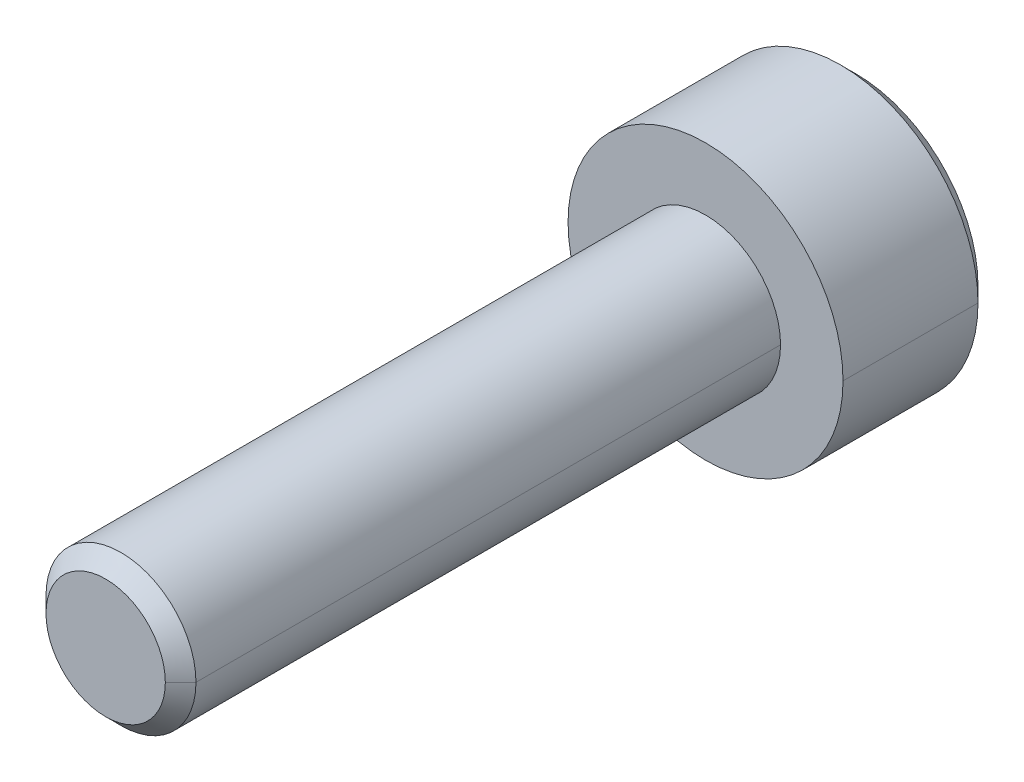
ISO-10303-21;
HEADER;
FILE_DESCRIPTION(('STEP AP214'),'2;1');
FILE_NAME('part.step','',(''),(''),'','','');
FILE_SCHEMA(('AUTOMOTIVE_DESIGN { 1 0 10303 214 1 1 1 1 }'));
ENDSEC;
DATA;
#1=APPLICATION_CONTEXT('core data for automotive mechanical design processes');
#2=APPLICATION_PROTOCOL_DEFINITION('international standard','automotive_design',2000,#1);
#3=PRODUCT_CONTEXT('',#1,'mechanical');
#4=PRODUCT('Part','Part','',(#3));
#5=PRODUCT_RELATED_PRODUCT_CATEGORY('part','',(#4));
#6=PRODUCT_DEFINITION_FORMATION('','',#4);
#7=PRODUCT_DEFINITION_CONTEXT('part definition',#1,'design');
#8=PRODUCT_DEFINITION('design','',#6,#7);
#9=PRODUCT_DEFINITION_SHAPE('','',#8);
#10=(LENGTH_UNIT() NAMED_UNIT(*) SI_UNIT(.MILLI.,.METRE.));
#11=(NAMED_UNIT(*) PLANE_ANGLE_UNIT() SI_UNIT($,.RADIAN.));
#12=(NAMED_UNIT(*) SI_UNIT($,.STERADIAN.) SOLID_ANGLE_UNIT());
#13=UNCERTAINTY_MEASURE_WITH_UNIT(LENGTH_MEASURE(1.E-05),#10,'distance_accuracy_value','');
#14=(GEOMETRIC_REPRESENTATION_CONTEXT(3) GLOBAL_UNCERTAINTY_ASSIGNED_CONTEXT((#13)) GLOBAL_UNIT_ASSIGNED_CONTEXT((#10,
#11,#12)) REPRESENTATION_CONTEXT('',''));
#15=CARTESIAN_POINT('',(0.,0.,0.));
#16=DIRECTION('',(0.,0.,1.));
#17=DIRECTION('',(1.,0.,0.));
#18=AXIS2_PLACEMENT_3D('',#15,#16,#17);
#19=CARTESIAN_POINT('',(0.,0.,1.3));
#20=DIRECTION('',(0.,0.,-1.));
#21=DIRECTION('',(0.,-1.,0.));
#22=AXIS2_PLACEMENT_3D('',#19,#20,#21);
#23=PLANE('',#22);
#24=DIRECTION('',(0.866025403784439,0.5,0.));
#25=VECTOR('',#24,1.);
#26=CARTESIAN_POINT('',(-1.25,0.721687836487033,1.3));
#27=LINE('',#26,#25);
#28=CARTESIAN_POINT('',(-1.25,0.721687836487033,1.3));
#29=VERTEX_POINT('',#28);
#30=CARTESIAN_POINT('',(0.,1.44337567297406,1.3));
#31=VERTEX_POINT('',#30);
#32=EDGE_CURVE('E212',#29,#31,#27,.T.);
#33=ORIENTED_EDGE('',*,*,#32,.T.);
#34=DIRECTION('',(0.866025403784439,-0.5,0.));
#35=VECTOR('',#34,1.);
#36=CARTESIAN_POINT('',(0.,1.44337567297406,1.3));
#37=LINE('',#36,#35);
#38=CARTESIAN_POINT('',(1.25,0.721687836487033,1.3));
#39=VERTEX_POINT('',#38);
#40=EDGE_CURVE('E9',#31,#39,#37,.T.);
#41=ORIENTED_EDGE('',*,*,#40,.T.);
#42=DIRECTION('',(0.,-1.,0.));
#43=VECTOR('',#42,1.);
#44=CARTESIAN_POINT('',(1.25,0.721687836487033,1.3));
#45=LINE('',#44,#43);
#46=CARTESIAN_POINT('',(1.25,-0.721687836487033,1.3));
#47=VERTEX_POINT('',#46);
#48=EDGE_CURVE('E43',#39,#47,#45,.T.);
#49=ORIENTED_EDGE('',*,*,#48,.T.);
#50=DIRECTION('',(-0.866025403784439,-0.5,0.));
#51=VECTOR('',#50,1.);
#52=CARTESIAN_POINT('',(1.25,-0.721687836487033,1.3));
#53=LINE('',#52,#51);
#54=CARTESIAN_POINT('',(0.,-1.44337567297406,1.3));
#55=VERTEX_POINT('',#54);
#56=EDGE_CURVE('E265',#47,#55,#53,.T.);
#57=ORIENTED_EDGE('',*,*,#56,.T.);
#58=DIRECTION('',(-0.866025403784439,0.5,0.));
#59=VECTOR('',#58,1.);
#60=CARTESIAN_POINT('',(0.,-1.44337567297406,1.3));
#61=LINE('',#60,#59);
#62=CARTESIAN_POINT('',(-1.25,-0.721687836487033,1.3));
#63=VERTEX_POINT('',#62);
#64=EDGE_CURVE('E184',#55,#63,#61,.T.);
#65=ORIENTED_EDGE('',*,*,#64,.T.);
#66=DIRECTION('',(0.,1.,0.));
#67=VECTOR('',#66,1.);
#68=CARTESIAN_POINT('',(-1.25,-0.721687836487033,1.3));
#69=LINE('',#68,#67);
#70=EDGE_CURVE('E163',#63,#29,#69,.T.);
#71=ORIENTED_EDGE('',*,*,#70,.T.);
#72=EDGE_LOOP('',(#33,#41,#49,#57,#65,#71));
#73=FACE_BOUND('',#72,.T.);
#74=ADVANCED_FACE('F15',(#73),#23,.T.);
#75=CARTESIAN_POINT('',(0.,1.44337567297406,1.3));
#76=DIRECTION('',(0.5,0.866025403784439,0.));
#77=DIRECTION('',(0.,0.,-1.));
#78=AXIS2_PLACEMENT_3D('',#75,#76,#77);
#79=PLANE('',#78);
#80=DIRECTION('',(0.866025403784439,-0.5,0.));
#81=VECTOR('',#80,1.);
#82=CARTESIAN_POINT('',(0.,1.44337567297406,0.));
#83=LINE('',#82,#81);
#84=CARTESIAN_POINT('',(0.,1.44337567297406,0.));
#85=VERTEX_POINT('',#84);
#86=CARTESIAN_POINT('',(1.25,0.721687836487033,0.));
#87=VERTEX_POINT('',#86);
#88=EDGE_CURVE('E197',#85,#87,#83,.T.);
#89=ORIENTED_EDGE('',*,*,#88,.T.);
#90=DIRECTION('',(0.,0.,-1.));
#91=VECTOR('',#90,1.);
#92=CARTESIAN_POINT('',(1.25,0.721687836487033,1.3));
#93=LINE('',#92,#91);
#94=EDGE_CURVE('E18',#39,#87,#93,.T.);
#95=ORIENTED_EDGE('',*,*,#94,.F.);
#96=ORIENTED_EDGE('',*,*,#40,.F.);
#97=DIRECTION('',(0.,0.,-1.));
#98=VECTOR('',#97,1.);
#99=CARTESIAN_POINT('',(0.,1.44337567297406,1.3));
#100=LINE('',#99,#98);
#101=EDGE_CURVE('E143',#31,#85,#100,.T.);
#102=ORIENTED_EDGE('',*,*,#101,.T.);
#103=EDGE_LOOP('',(#89,#95,#96,#102));
#104=FACE_BOUND('',#103,.T.);
#105=ADVANCED_FACE('F287',(#104),#79,.F.);
#106=CARTESIAN_POINT('',(1.25,0.721687836487033,1.3));
#107=DIRECTION('',(1.,0.,0.));
#108=DIRECTION('',(0.,1.,0.));
#109=AXIS2_PLACEMENT_3D('',#106,#107,#108);
#110=PLANE('',#109);
#111=DIRECTION('',(0.,-1.,0.));
#112=VECTOR('',#111,1.);
#113=CARTESIAN_POINT('',(1.25,0.721687836487033,0.));
#114=LINE('',#113,#112);
#115=CARTESIAN_POINT('',(1.25,-0.721687836487033,0.));
#116=VERTEX_POINT('',#115);
#117=EDGE_CURVE('E250',#87,#116,#114,.T.);
#118=ORIENTED_EDGE('',*,*,#117,.T.);
#119=DIRECTION('',(0.,0.,-1.));
#120=VECTOR('',#119,1.);
#121=CARTESIAN_POINT('',(1.25,-0.721687836487033,1.3));
#122=LINE('',#121,#120);
#123=EDGE_CURVE('E268',#47,#116,#122,.T.);
#124=ORIENTED_EDGE('',*,*,#123,.F.);
#125=ORIENTED_EDGE('',*,*,#48,.F.);
#126=ORIENTED_EDGE('',*,*,#94,.T.);
#127=EDGE_LOOP('',(#118,#124,#125,#126));
#128=FACE_BOUND('',#127,.T.);
#129=ADVANCED_FACE('F278',(#128),#110,.F.);
#130=CARTESIAN_POINT('',(1.25,-0.721687836487033,1.3));
#131=DIRECTION('',(0.5,-0.866025403784439,0.));
#132=DIRECTION('',(0.,0.,-1.));
#133=AXIS2_PLACEMENT_3D('',#130,#131,#132);
#134=PLANE('',#133);
#135=DIRECTION('',(-0.866025403784439,-0.5,0.));
#136=VECTOR('',#135,1.);
#137=CARTESIAN_POINT('',(1.25,-0.721687836487033,0.));
#138=LINE('',#137,#136);
#139=CARTESIAN_POINT('',(0.,-1.44337567297406,0.));
#140=VERTEX_POINT('',#139);
#141=EDGE_CURVE('E245',#116,#140,#138,.T.);
#142=ORIENTED_EDGE('',*,*,#141,.T.);
#143=DIRECTION('',(0.,0.,-1.));
#144=VECTOR('',#143,1.);
#145=CARTESIAN_POINT('',(0.,-1.44337567297406,1.3));
#146=LINE('',#145,#144);
#147=EDGE_CURVE('E262',#55,#140,#146,.T.);
#148=ORIENTED_EDGE('',*,*,#147,.F.);
#149=ORIENTED_EDGE('',*,*,#56,.F.);
#150=ORIENTED_EDGE('',*,*,#123,.T.);
#151=EDGE_LOOP('',(#142,#148,#149,#150));
#152=FACE_BOUND('',#151,.T.);
#153=ADVANCED_FACE('F304',(#152),#134,.F.);
#154=CARTESIAN_POINT('',(0.,-1.44337567297406,1.3));
#155=DIRECTION('',(-0.5,-0.866025403784439,0.));
#156=DIRECTION('',(-0.866025403784439,0.5,0.));
#157=AXIS2_PLACEMENT_3D('',#154,#155,#156);
#158=PLANE('',#157);
#159=DIRECTION('',(-0.866025403784439,0.5,0.));
#160=VECTOR('',#159,1.);
#161=CARTESIAN_POINT('',(0.,-1.44337567297406,0.));
#162=LINE('',#161,#160);
#163=CARTESIAN_POINT('',(-1.25,-0.721687836487033,0.));
#164=VERTEX_POINT('',#163);
#165=EDGE_CURVE('E242',#140,#164,#162,.T.);
#166=ORIENTED_EDGE('',*,*,#165,.T.);
#167=DIRECTION('',(0.,0.,-1.));
#168=VECTOR('',#167,1.);
#169=CARTESIAN_POINT('',(-1.25,-0.721687836487033,1.3));
#170=LINE('',#169,#168);
#171=EDGE_CURVE('E181',#63,#164,#170,.T.);
#172=ORIENTED_EDGE('',*,*,#171,.F.);
#173=ORIENTED_EDGE('',*,*,#64,.F.);
#174=ORIENTED_EDGE('',*,*,#147,.T.);
#175=EDGE_LOOP('',(#166,#172,#173,#174));
#176=FACE_BOUND('',#175,.T.);
#177=ADVANCED_FACE('F300',(#176),#158,.F.);
#178=CARTESIAN_POINT('',(-1.25,-0.721687836487033,1.3));
#179=DIRECTION('',(-1.,0.,0.));
#180=DIRECTION('',(0.,0.,1.));
#181=AXIS2_PLACEMENT_3D('',#178,#179,#180);
#182=PLANE('',#181);
#183=DIRECTION('',(0.,1.,0.));
#184=VECTOR('',#183,1.);
#185=CARTESIAN_POINT('',(-1.25,-0.721687836487033,0.));
#186=LINE('',#185,#184);
#187=CARTESIAN_POINT('',(-1.25,0.721687836487033,0.));
#188=VERTEX_POINT('',#187);
#189=EDGE_CURVE('E238',#164,#188,#186,.T.);
#190=ORIENTED_EDGE('',*,*,#189,.T.);
#191=DIRECTION('',(0.,0.,-1.));
#192=VECTOR('',#191,1.);
#193=CARTESIAN_POINT('',(-1.25,0.721687836487033,1.3));
#194=LINE('',#193,#192);
#195=EDGE_CURVE('E209',#29,#188,#194,.T.);
#196=ORIENTED_EDGE('',*,*,#195,.F.);
#197=ORIENTED_EDGE('',*,*,#70,.F.);
#198=ORIENTED_EDGE('',*,*,#171,.T.);
#199=EDGE_LOOP('',(#190,#196,#197,#198));
#200=FACE_BOUND('',#199,.T.);
#201=ADVANCED_FACE('F295',(#200),#182,.F.);
#202=CARTESIAN_POINT('',(-1.25,0.721687836487033,1.3));
#203=DIRECTION('',(-0.5,0.866025403784439,0.));
#204=DIRECTION('',(0.,0.,1.));
#205=AXIS2_PLACEMENT_3D('',#202,#203,#204);
#206=PLANE('',#205);
#207=DIRECTION('',(0.866025403784439,0.5,0.));
#208=VECTOR('',#207,1.);
#209=CARTESIAN_POINT('',(-1.25,0.721687836487033,0.));
#210=LINE('',#209,#208);
#211=EDGE_CURVE('E234',#188,#85,#210,.T.);
#212=ORIENTED_EDGE('',*,*,#211,.T.);
#213=ORIENTED_EDGE('',*,*,#101,.F.);
#214=ORIENTED_EDGE('',*,*,#32,.F.);
#215=ORIENTED_EDGE('',*,*,#195,.T.);
#216=EDGE_LOOP('',(#212,#213,#214,#215));
#217=FACE_BOUND('',#216,.T.);
#218=ADVANCED_FACE('F291',(#217),#206,.F.);
#219=CARTESIAN_POINT('',(0.,0.,15.));
#220=DIRECTION('',(0.,0.,-1.));
#221=DIRECTION('',(-1.,0.,0.));
#222=AXIS2_PLACEMENT_3D('',#219,#220,#221);
#223=CONICAL_SURFACE('',#222,1.1935,0.785398163397449);
#224=DIRECTION('',(0.707106781186549,0.,-0.707106781186547));
#225=VECTOR('',#224,1.);
#226=CARTESIAN_POINT('',(1.1935,0.,15.));
#227=LINE('',#226,#225);
#228=CARTESIAN_POINT('',(1.1935,0.,15.));
#229=VERTEX_POINT('',#228);
#230=CARTESIAN_POINT('',(1.5,0.,14.6935));
#231=VERTEX_POINT('',#230);
#232=EDGE_CURVE('E147',#229,#231,#227,.T.);
#233=ORIENTED_EDGE('',*,*,#232,.F.);
#234=CARTESIAN_POINT('',(0.,0.,15.));
#235=DIRECTION('',(0.,0.,1.));
#236=DIRECTION('',(1.,0.,0.));
#237=AXIS2_PLACEMENT_3D('',#234,#235,#236);
#238=CIRCLE('',#237,1.1935);
#239=CARTESIAN_POINT('',(-1.1935,0.,15.));
#240=VERTEX_POINT('',#239);
#241=EDGE_CURVE('E134',#240,#229,#238,.T.);
#242=ORIENTED_EDGE('',*,*,#241,.F.);
#243=DIRECTION('',(-0.707106781186549,0.,-0.707106781186547));
#244=VECTOR('',#243,1.);
#245=CARTESIAN_POINT('',(-1.1935,0.,15.));
#246=LINE('',#245,#244);
#247=CARTESIAN_POINT('',(-1.5,0.,14.6935));
#248=VERTEX_POINT('',#247);
#249=EDGE_CURVE('E156',#240,#248,#246,.T.);
#250=ORIENTED_EDGE('',*,*,#249,.T.);
#251=CARTESIAN_POINT('',(0.,0.,14.6935));
#252=DIRECTION('',(0.,0.,-1.));
#253=DIRECTION('',(1.,0.,0.));
#254=AXIS2_PLACEMENT_3D('',#251,#252,#253);
#255=CIRCLE('',#254,1.5);
#256=EDGE_CURVE('E144',#231,#248,#255,.T.);
#257=ORIENTED_EDGE('',*,*,#256,.F.);
#258=EDGE_LOOP('',(#233,#242,#250,#257));
#259=FACE_BOUND('',#258,.T.);
#260=ADVANCED_FACE('F148',(#259),#223,.T.);
#261=CARTESIAN_POINT('',(0.,0.,0.300000000000003));
#262=DIRECTION('',(0.,0.,1.));
#263=DIRECTION('',(1.,0.,0.));
#264=AXIS2_PLACEMENT_3D('',#261,#262,#263);
#265=CONICAL_SURFACE('',#264,2.75,0.785398163397447);
#266=DIRECTION('',(-0.707106781186547,0.,0.707106781186549));
#267=VECTOR('',#266,1.);
#268=CARTESIAN_POINT('',(-2.75,0.,0.300000000000003));
#269=LINE('',#268,#267);
#270=CARTESIAN_POINT('',(-2.45,0.,0.));
#271=VERTEX_POINT('',#270);
#272=CARTESIAN_POINT('',(-2.75,0.,0.300000000000003));
#273=VERTEX_POINT('',#272);
#274=EDGE_CURVE('E188',#271,#273,#269,.T.);
#275=ORIENTED_EDGE('',*,*,#274,.F.);
#276=CARTESIAN_POINT('',(0.,0.,0.));
#277=DIRECTION('',(0.,0.,-1.));
#278=DIRECTION('',(1.,0.,0.));
#279=AXIS2_PLACEMENT_3D('',#276,#277,#278);
#280=CIRCLE('',#279,2.45);
#281=CARTESIAN_POINT('',(2.45,0.,0.));
#282=VERTEX_POINT('',#281);
#283=EDGE_CURVE('E194',#282,#271,#280,.T.);
#284=ORIENTED_EDGE('',*,*,#283,.F.);
#285=DIRECTION('',(0.707106781186547,0.,0.707106781186549));
#286=VECTOR('',#285,1.);
#287=CARTESIAN_POINT('',(2.75,0.,0.300000000000003));
#288=LINE('',#287,#286);
#289=CARTESIAN_POINT('',(2.75,0.,0.300000000000003));
#290=VERTEX_POINT('',#289);
#291=EDGE_CURVE('E173',#282,#290,#288,.T.);
#292=ORIENTED_EDGE('',*,*,#291,.T.);
#293=CARTESIAN_POINT('',(0.,0.,0.300000000000003));
#294=DIRECTION('',(0.,0.,1.));
#295=DIRECTION('',(1.,0.,0.));
#296=AXIS2_PLACEMENT_3D('',#293,#294,#295);
#297=CIRCLE('',#296,2.75);
#298=EDGE_CURVE('E192',#273,#290,#297,.T.);
#299=ORIENTED_EDGE('',*,*,#298,.F.);
#300=EDGE_LOOP('',(#275,#284,#292,#299));
#301=FACE_BOUND('',#300,.T.);
#302=ADVANCED_FACE('F507',(#301),#265,.T.);
#303=CARTESIAN_POINT('',(0.,0.,15.));
#304=DIRECTION('',(0.,0.,1.));
#305=DIRECTION('',(1.,0.,0.));
#306=AXIS2_PLACEMENT_3D('',#303,#304,#305);
#307=PLANE('',#306);
#308=ORIENTED_EDGE('',*,*,#241,.T.);
#309=CARTESIAN_POINT('',(0.,0.,15.));
#310=DIRECTION('',(0.,0.,1.));
#311=DIRECTION('',(1.,0.,0.));
#312=AXIS2_PLACEMENT_3D('',#309,#310,#311);
#313=CIRCLE('',#312,1.1935);
#314=EDGE_CURVE('E138',#229,#240,#313,.T.);
#315=ORIENTED_EDGE('',*,*,#314,.T.);
#316=EDGE_LOOP('',(#308,#315));
#317=FACE_BOUND('',#316,.T.);
#318=ADVANCED_FACE('F136',(#317),#307,.T.);
#319=CARTESIAN_POINT('',(0.,0.,15.));
#320=DIRECTION('',(0.,0.,-1.));
#321=DIRECTION('',(-1.,0.,0.));
#322=AXIS2_PLACEMENT_3D('',#319,#320,#321);
#323=CYLINDRICAL_SURFACE('',#322,1.5);
#324=DIRECTION('',(0.,0.,-1.));
#325=VECTOR('',#324,1.);
#326=CARTESIAN_POINT('',(1.5,0.,15.));
#327=LINE('',#326,#325);
#328=CARTESIAN_POINT('',(1.5,0.,3.));
#329=VERTEX_POINT('',#328);
#330=EDGE_CURVE('E168',#231,#329,#327,.T.);
#331=ORIENTED_EDGE('',*,*,#330,.F.);
#332=ORIENTED_EDGE('',*,*,#256,.T.);
#333=DIRECTION('',(0.,0.,-1.));
#334=VECTOR('',#333,1.);
#335=CARTESIAN_POINT('',(-1.5,0.,15.));
#336=LINE('',#335,#334);
#337=CARTESIAN_POINT('',(-1.5,0.,3.));
#338=VERTEX_POINT('',#337);
#339=EDGE_CURVE('E208',#248,#338,#336,.T.);
#340=ORIENTED_EDGE('',*,*,#339,.T.);
#341=CARTESIAN_POINT('',(0.,0.,3.));
#342=DIRECTION('',(0.,0.,1.));
#343=DIRECTION('',(1.,0.,0.));
#344=AXIS2_PLACEMENT_3D('',#341,#342,#343);
#345=CIRCLE('',#344,1.5);
#346=EDGE_CURVE('E198',#338,#329,#345,.T.);
#347=ORIENTED_EDGE('',*,*,#346,.T.);
#348=EDGE_LOOP('',(#331,#332,#340,#347));
#349=FACE_BOUND('',#348,.T.);
#350=ADVANCED_FACE('F577',(#349),#323,.T.);
#351=CARTESIAN_POINT('',(0.,0.,0.));
#352=DIRECTION('',(0.,0.,1.));
#353=DIRECTION('',(1.,0.,0.));
#354=AXIS2_PLACEMENT_3D('',#351,#352,#353);
#355=PLANE('',#354);
#356=ORIENTED_EDGE('',*,*,#88,.F.);
#357=ORIENTED_EDGE('',*,*,#211,.F.);
#358=ORIENTED_EDGE('',*,*,#189,.F.);
#359=ORIENTED_EDGE('',*,*,#165,.F.);
#360=ORIENTED_EDGE('',*,*,#141,.F.);
#361=ORIENTED_EDGE('',*,*,#117,.F.);
#362=EDGE_LOOP('',(#356,#357,#358,#359,#360,#361));
#363=FACE_BOUND('',#362,.T.);
#364=ORIENTED_EDGE('',*,*,#283,.T.);
#365=CARTESIAN_POINT('',(0.,0.,0.));
#366=DIRECTION('',(0.,0.,-1.));
#367=DIRECTION('',(1.,0.,0.));
#368=AXIS2_PLACEMENT_3D('',#365,#366,#367);
#369=CIRCLE('',#368,2.45);
#370=EDGE_CURVE('E176',#271,#282,#369,.T.);
#371=ORIENTED_EDGE('',*,*,#370,.T.);
#372=EDGE_LOOP('',(#364,#371));
#373=FACE_BOUND('',#372,.T.);
#374=ADVANCED_FACE('F283',(#363,#373),#355,.F.);
#375=CARTESIAN_POINT('',(0.,0.,3.));
#376=DIRECTION('',(0.,0.,1.));
#377=DIRECTION('',(1.,0.,0.));
#378=AXIS2_PLACEMENT_3D('',#375,#376,#377);
#379=PLANE('',#378);
#380=ORIENTED_EDGE('',*,*,#346,.F.);
#381=CARTESIAN_POINT('',(0.,0.,3.));
#382=DIRECTION('',(0.,0.,1.));
#383=DIRECTION('',(1.,0.,0.));
#384=AXIS2_PLACEMENT_3D('',#381,#382,#383);
#385=CIRCLE('',#384,1.5);
#386=EDGE_CURVE('E172',#329,#338,#385,.T.);
#387=ORIENTED_EDGE('',*,*,#386,.F.);
#388=EDGE_LOOP('',(#380,#387));
#389=FACE_BOUND('',#388,.T.);
#390=CARTESIAN_POINT('',(0.,0.,3.));
#391=DIRECTION('',(0.,0.,1.));
#392=DIRECTION('',(1.,0.,0.));
#393=AXIS2_PLACEMENT_3D('',#390,#391,#392);
#394=CIRCLE('',#393,2.75);
#395=CARTESIAN_POINT('',(-2.75,0.,3.));
#396=VERTEX_POINT('',#395);
#397=CARTESIAN_POINT('',(2.75,0.,3.));
#398=VERTEX_POINT('',#397);
#399=EDGE_CURVE('E189',#396,#398,#394,.T.);
#400=ORIENTED_EDGE('',*,*,#399,.T.);
#401=CARTESIAN_POINT('',(0.,0.,3.));
#402=DIRECTION('',(0.,0.,1.));
#403=DIRECTION('',(1.,0.,0.));
#404=AXIS2_PLACEMENT_3D('',#401,#402,#403);
#405=CIRCLE('',#404,2.75);
#406=EDGE_CURVE('E216',#398,#396,#405,.T.);
#407=ORIENTED_EDGE('',*,*,#406,.T.);
#408=EDGE_LOOP('',(#400,#407));
#409=FACE_BOUND('',#408,.T.);
#410=ADVANCED_FACE('F559',(#389,#409),#379,.T.);
#411=CARTESIAN_POINT('',(0.,0.,3.));
#412=DIRECTION('',(0.,0.,-1.));
#413=DIRECTION('',(-1.,0.,0.));
#414=AXIS2_PLACEMENT_3D('',#411,#412,#413);
#415=CYLINDRICAL_SURFACE('',#414,2.75);
#416=DIRECTION('',(0.,0.,-1.));
#417=VECTOR('',#416,1.);
#418=CARTESIAN_POINT('',(2.75,0.,3.));
#419=LINE('',#418,#417);
#420=EDGE_CURVE('E220',#398,#290,#419,.T.);
#421=ORIENTED_EDGE('',*,*,#420,.F.);
#422=ORIENTED_EDGE('',*,*,#399,.F.);
#423=DIRECTION('',(0.,0.,-1.));
#424=VECTOR('',#423,1.);
#425=CARTESIAN_POINT('',(-2.75,0.,3.));
#426=LINE('',#425,#424);
#427=EDGE_CURVE('E193',#396,#273,#426,.T.);
#428=ORIENTED_EDGE('',*,*,#427,.T.);
#429=ORIENTED_EDGE('',*,*,#298,.T.);
#430=EDGE_LOOP('',(#421,#422,#428,#429));
#431=FACE_BOUND('',#430,.T.);
#432=ADVANCED_FACE('F539',(#431),#415,.T.);
#433=CARTESIAN_POINT('',(0.,0.,3.));
#434=DIRECTION('',(0.,0.,-1.));
#435=DIRECTION('',(-1.,0.,0.));
#436=AXIS2_PLACEMENT_3D('',#433,#434,#435);
#437=CYLINDRICAL_SURFACE('',#436,2.75);
#438=ORIENTED_EDGE('',*,*,#406,.F.);
#439=ORIENTED_EDGE('',*,*,#420,.T.);
#440=CARTESIAN_POINT('',(0.,0.,0.300000000000003));
#441=DIRECTION('',(0.,0.,1.));
#442=DIRECTION('',(1.,0.,0.));
#443=AXIS2_PLACEMENT_3D('',#440,#441,#442);
#444=CIRCLE('',#443,2.75);
#445=EDGE_CURVE('E180',#290,#273,#444,.T.);
#446=ORIENTED_EDGE('',*,*,#445,.T.);
#447=ORIENTED_EDGE('',*,*,#427,.F.);
#448=EDGE_LOOP('',(#438,#439,#446,#447));
#449=FACE_BOUND('',#448,.T.);
#450=ADVANCED_FACE('F528',(#449),#437,.T.);
#451=CARTESIAN_POINT('',(0.,0.,15.));
#452=DIRECTION('',(0.,0.,-1.));
#453=DIRECTION('',(-1.,0.,0.));
#454=AXIS2_PLACEMENT_3D('',#451,#452,#453);
#455=CYLINDRICAL_SURFACE('',#454,1.5);
#456=CARTESIAN_POINT('',(0.,0.,14.6935));
#457=DIRECTION('',(0.,0.,-1.));
#458=DIRECTION('',(1.,0.,0.));
#459=AXIS2_PLACEMENT_3D('',#456,#457,#458);
#460=CIRCLE('',#459,1.5);
#461=EDGE_CURVE('E153',#248,#231,#460,.T.);
#462=ORIENTED_EDGE('',*,*,#461,.T.);
#463=ORIENTED_EDGE('',*,*,#330,.T.);
#464=ORIENTED_EDGE('',*,*,#386,.T.);
#465=ORIENTED_EDGE('',*,*,#339,.F.);
#466=EDGE_LOOP('',(#462,#463,#464,#465));
#467=FACE_BOUND('',#466,.T.);
#468=ADVANCED_FACE('F517',(#467),#455,.T.);
#469=CARTESIAN_POINT('',(0.,0.,0.300000000000003));
#470=DIRECTION('',(0.,0.,1.));
#471=DIRECTION('',(1.,0.,0.));
#472=AXIS2_PLACEMENT_3D('',#469,#470,#471);
#473=CONICAL_SURFACE('',#472,2.75,0.785398163397447);
#474=ORIENTED_EDGE('',*,*,#370,.F.);
#475=ORIENTED_EDGE('',*,*,#274,.T.);
#476=ORIENTED_EDGE('',*,*,#445,.F.);
#477=ORIENTED_EDGE('',*,*,#291,.F.);
#478=EDGE_LOOP('',(#474,#475,#476,#477));
#479=FACE_BOUND('',#478,.T.);
#480=ADVANCED_FACE('F497',(#479),#473,.T.);
#481=CARTESIAN_POINT('',(0.,0.,15.));
#482=DIRECTION('',(0.,0.,-1.));
#483=DIRECTION('',(-1.,0.,0.));
#484=AXIS2_PLACEMENT_3D('',#481,#482,#483);
#485=CONICAL_SURFACE('',#484,1.1935,0.785398163397449);
#486=ORIENTED_EDGE('',*,*,#314,.F.);
#487=ORIENTED_EDGE('',*,*,#232,.T.);
#488=ORIENTED_EDGE('',*,*,#461,.F.);
#489=ORIENTED_EDGE('',*,*,#249,.F.);
#490=EDGE_LOOP('',(#486,#487,#488,#489));
#491=FACE_BOUND('',#490,.T.);
#492=ADVANCED_FACE('F155',(#491),#485,.T.);
#493=CLOSED_SHELL('',(#74,#105,#129,#153,#177,#201,#218,#260,#302,#318,#350,#374,#410,#432,#450,
#468,#480,#492));
#494=MANIFOLD_SOLID_BREP('B1',#493);
#495=ADVANCED_BREP_SHAPE_REPRESENTATION('',(#18,#494),#14);
#496=SHAPE_DEFINITION_REPRESENTATION(#9,#495);
ENDSEC;
END-ISO-10303-21;
